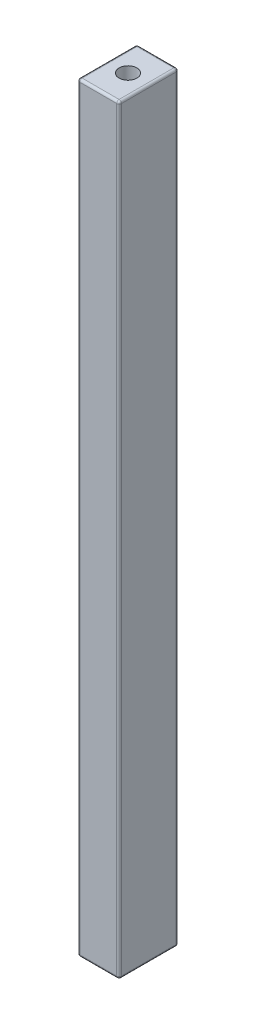
ISO-10303-21;
HEADER;
FILE_DESCRIPTION(('STEP AP214'),'2;1');
FILE_NAME('part.step','',(''),(''),'','','');
FILE_SCHEMA(('AUTOMOTIVE_DESIGN { 1 0 10303 214 1 1 1 1 }'));
ENDSEC;
DATA;
#1=APPLICATION_CONTEXT('core data for automotive mechanical design processes');
#2=APPLICATION_PROTOCOL_DEFINITION('international standard','automotive_design',2000,#1);
#3=PRODUCT_CONTEXT('',#1,'mechanical');
#4=PRODUCT('Part','Part','',(#3));
#5=PRODUCT_RELATED_PRODUCT_CATEGORY('part','',(#4));
#6=PRODUCT_DEFINITION_FORMATION('','',#4);
#7=PRODUCT_DEFINITION_CONTEXT('part definition',#1,'design');
#8=PRODUCT_DEFINITION('design','',#6,#7);
#9=PRODUCT_DEFINITION_SHAPE('','',#8);
#10=(LENGTH_UNIT() NAMED_UNIT(*) SI_UNIT(.MILLI.,.METRE.));
#11=(NAMED_UNIT(*) PLANE_ANGLE_UNIT() SI_UNIT($,.RADIAN.));
#12=(NAMED_UNIT(*) SI_UNIT($,.STERADIAN.) SOLID_ANGLE_UNIT());
#13=UNCERTAINTY_MEASURE_WITH_UNIT(LENGTH_MEASURE(1.E-05),#10,'distance_accuracy_value','');
#14=(GEOMETRIC_REPRESENTATION_CONTEXT(3) GLOBAL_UNCERTAINTY_ASSIGNED_CONTEXT((#13)) GLOBAL_UNIT_ASSIGNED_CONTEXT((#10,
#11,#12)) REPRESENTATION_CONTEXT('',''));
#15=CARTESIAN_POINT('',(0.,0.,0.));
#16=DIRECTION('',(0.,0.,1.));
#17=DIRECTION('',(1.,0.,0.));
#18=AXIS2_PLACEMENT_3D('',#15,#16,#17);
#19=CARTESIAN_POINT('',(-22.225,812.8,31.75));
#20=DIRECTION('',(1.,0.,0.));
#21=DIRECTION('',(0.,0.,1.));
#22=AXIS2_PLACEMENT_3D('',#19,#20,#21);
#23=PLANE('',#22);
#24=DIRECTION('',(0.,-1.,0.));
#25=VECTOR('',#24,1.);
#26=CARTESIAN_POINT('',(-22.225,738.8225,80.9625));
#27=LINE('',#26,#25);
#28=CARTESIAN_POINT('',(-22.225,738.8225,80.9625));
#29=VERTEX_POINT('',#28);
#30=CARTESIAN_POINT('',(-22.225,129.2225,80.9624999999999));
#31=VERTEX_POINT('',#30);
#32=EDGE_CURVE('E277',#29,#31,#27,.T.);
#33=ORIENTED_EDGE('',*,*,#32,.T.);
#34=CARTESIAN_POINT('',(-22.225,129.2225,73.0249999999999));
#35=DIRECTION('',(1.,0.,0.));
#36=DIRECTION('',(0.,0.,-1.));
#37=AXIS2_PLACEMENT_3D('',#34,#35,#36);
#38=CIRCLE('',#37,7.9375);
#39=CARTESIAN_POINT('',(-22.225,129.2225,65.0874999999999));
#40=VERTEX_POINT('',#39);
#41=EDGE_CURVE('E280',#31,#40,#38,.T.);
#42=ORIENTED_EDGE('',*,*,#41,.T.);
#43=DIRECTION('',(0.,1.,0.));
#44=VECTOR('',#43,1.);
#45=CARTESIAN_POINT('',(-22.225,738.8225,65.0875));
#46=LINE('',#45,#44);
#47=CARTESIAN_POINT('',(-22.225,738.8225,65.0875));
#48=VERTEX_POINT('',#47);
#49=EDGE_CURVE('E268',#40,#48,#46,.T.);
#50=ORIENTED_EDGE('',*,*,#49,.T.);
#51=CARTESIAN_POINT('',(-22.225,738.8225,73.025));
#52=DIRECTION('',(1.,0.,0.));
#53=DIRECTION('',(0.,0.,-1.));
#54=AXIS2_PLACEMENT_3D('',#51,#52,#53);
#55=CIRCLE('',#54,7.9375);
#56=EDGE_CURVE('E235',#48,#29,#55,.T.);
#57=ORIENTED_EDGE('',*,*,#56,.T.);
#58=EDGE_LOOP('',(#33,#42,#50,#57));
#59=FACE_BOUND('',#58,.T.);
#60=DIRECTION('',(0.,0.,-1.));
#61=VECTOR('',#60,1.);
#62=CARTESIAN_POINT('',(-22.225,810.26,95.25));
#63=LINE('',#62,#61);
#64=CARTESIAN_POINT('',(-22.225,810.26,34.29));
#65=VERTEX_POINT('',#64);
#66=CARTESIAN_POINT('',(-22.225,810.26,92.71));
#67=VERTEX_POINT('',#66);
#68=EDGE_CURVE('E350',#65,#67,#63,.F.);
#69=ORIENTED_EDGE('',*,*,#68,.F.);
#70=DIRECTION('',(0.,-1.,0.));
#71=VECTOR('',#70,1.);
#72=CARTESIAN_POINT('',(-22.225,812.8,34.29));
#73=LINE('',#72,#71);
#74=CARTESIAN_POINT('',(-22.225,2.53999999999999,34.29));
#75=VERTEX_POINT('',#74);
#76=EDGE_CURVE('E347',#75,#65,#73,.F.);
#77=ORIENTED_EDGE('',*,*,#76,.F.);
#78=DIRECTION('',(0.,0.,-1.));
#79=VECTOR('',#78,1.);
#80=CARTESIAN_POINT('',(-22.225,2.53999999999999,31.75));
#81=LINE('',#80,#79);
#82=CARTESIAN_POINT('',(-22.225,2.53999999999999,92.71));
#83=VERTEX_POINT('',#82);
#84=EDGE_CURVE('E353',#83,#75,#81,.T.);
#85=ORIENTED_EDGE('',*,*,#84,.F.);
#86=DIRECTION('',(0.,-1.,0.));
#87=VECTOR('',#86,1.);
#88=CARTESIAN_POINT('',(-22.225,812.8,92.71));
#89=LINE('',#88,#87);
#90=EDGE_CURVE('E356',#67,#83,#89,.T.);
#91=ORIENTED_EDGE('',*,*,#90,.F.);
#92=EDGE_LOOP('',(#69,#77,#85,#91));
#93=FACE_BOUND('',#92,.T.);
#94=ADVANCED_FACE('F35',(#59,#93),#23,.F.);
#95=CARTESIAN_POINT('',(22.225,812.8,31.75));
#96=DIRECTION('',(0.,0.,1.));
#97=DIRECTION('',(-1.,0.,0.));
#98=AXIS2_PLACEMENT_3D('',#95,#96,#97);
#99=PLANE('',#98);
#100=DIRECTION('',(0.,-1.,0.));
#101=VECTOR('',#100,1.);
#102=CARTESIAN_POINT('',(-6.35000000000003,342.9,31.75));
#103=LINE('',#102,#101);
#104=CARTESIAN_POINT('',(-6.35000000000003,342.9,31.75));
#105=VERTEX_POINT('',#104);
#106=CARTESIAN_POINT('',(-6.34999999999997,292.1,31.75));
#107=VERTEX_POINT('',#106);
#108=EDGE_CURVE('E214',#105,#107,#103,.T.);
#109=ORIENTED_EDGE('',*,*,#108,.T.);
#110=CARTESIAN_POINT('',(0.,292.1,31.75));
#111=DIRECTION('',(0.,0.,1.));
#112=DIRECTION('',(1.,0.,0.));
#113=AXIS2_PLACEMENT_3D('',#110,#111,#112);
#114=CIRCLE('',#113,6.35);
#115=CARTESIAN_POINT('',(6.34999999999997,292.1,31.75));
#116=VERTEX_POINT('',#115);
#117=EDGE_CURVE('E223',#107,#116,#114,.T.);
#118=ORIENTED_EDGE('',*,*,#117,.T.);
#119=DIRECTION('',(0.,1.,0.));
#120=VECTOR('',#119,1.);
#121=CARTESIAN_POINT('',(6.34999999999997,342.9,31.75));
#122=LINE('',#121,#120);
#123=CARTESIAN_POINT('',(6.34999999999997,342.9,31.75));
#124=VERTEX_POINT('',#123);
#125=EDGE_CURVE('E220',#116,#124,#122,.T.);
#126=ORIENTED_EDGE('',*,*,#125,.T.);
#127=CARTESIAN_POINT('',(0.,342.9,31.75));
#128=DIRECTION('',(0.,0.,1.));
#129=DIRECTION('',(1.,0.,0.));
#130=AXIS2_PLACEMENT_3D('',#127,#128,#129);
#131=CIRCLE('',#130,6.35);
#132=EDGE_CURVE('E228',#124,#105,#131,.T.);
#133=ORIENTED_EDGE('',*,*,#132,.T.);
#134=EDGE_LOOP('',(#109,#118,#126,#133));
#135=FACE_BOUND('',#134,.T.);
#136=DIRECTION('',(0.,-1.,0.));
#137=VECTOR('',#136,1.);
#138=CARTESIAN_POINT('',(-6.35000000000008,762.,31.75));
#139=LINE('',#138,#137);
#140=CARTESIAN_POINT('',(-6.35000000000008,762.,31.75));
#141=VERTEX_POINT('',#140);
#142=CARTESIAN_POINT('',(-6.35000000000006,711.2,31.75));
#143=VERTEX_POINT('',#142);
#144=EDGE_CURVE('E250',#141,#143,#139,.T.);
#145=ORIENTED_EDGE('',*,*,#144,.T.);
#146=CARTESIAN_POINT('',(0.,711.2,31.75));
#147=DIRECTION('',(0.,0.,1.));
#148=DIRECTION('',(1.,0.,0.));
#149=AXIS2_PLACEMENT_3D('',#146,#147,#148);
#150=CIRCLE('',#149,6.35);
#151=CARTESIAN_POINT('',(6.34999999999993,711.2,31.75));
#152=VERTEX_POINT('',#151);
#153=EDGE_CURVE('E253',#143,#152,#150,.T.);
#154=ORIENTED_EDGE('',*,*,#153,.T.);
#155=DIRECTION('',(0.,1.,0.));
#156=VECTOR('',#155,1.);
#157=CARTESIAN_POINT('',(6.34999999999992,762.,31.75));
#158=LINE('',#157,#156);
#159=CARTESIAN_POINT('',(6.34999999999992,762.,31.75));
#160=VERTEX_POINT('',#159);
#161=EDGE_CURVE('E242',#152,#160,#158,.T.);
#162=ORIENTED_EDGE('',*,*,#161,.T.);
#163=CARTESIAN_POINT('',(0.,762.,31.75));
#164=DIRECTION('',(0.,0.,1.));
#165=DIRECTION('',(1.,0.,0.));
#166=AXIS2_PLACEMENT_3D('',#163,#164,#165);
#167=CIRCLE('',#166,6.35);
#168=EDGE_CURVE('E248',#160,#141,#167,.T.);
#169=ORIENTED_EDGE('',*,*,#168,.T.);
#170=EDGE_LOOP('',(#145,#154,#162,#169));
#171=FACE_BOUND('',#170,.T.);
#172=DIRECTION('',(1.,0.,0.));
#173=VECTOR('',#172,1.);
#174=CARTESIAN_POINT('',(22.225,2.53999999999999,31.75));
#175=LINE('',#174,#173);
#176=CARTESIAN_POINT('',(-19.685,2.53999999999999,31.75));
#177=VERTEX_POINT('',#176);
#178=CARTESIAN_POINT('',(19.685,2.53999999999999,31.75));
#179=VERTEX_POINT('',#178);
#180=EDGE_CURVE('E305',#177,#179,#175,.T.);
#181=ORIENTED_EDGE('',*,*,#180,.F.);
#182=DIRECTION('',(0.,-1.,0.));
#183=VECTOR('',#182,1.);
#184=CARTESIAN_POINT('',(-19.685,812.8,31.75));
#185=LINE('',#184,#183);
#186=CARTESIAN_POINT('',(-19.685,810.26,31.75));
#187=VERTEX_POINT('',#186);
#188=EDGE_CURVE('E299',#187,#177,#185,.T.);
#189=ORIENTED_EDGE('',*,*,#188,.F.);
#190=DIRECTION('',(1.,0.,0.));
#191=VECTOR('',#190,1.);
#192=CARTESIAN_POINT('',(-22.225,810.26,31.75));
#193=LINE('',#192,#191);
#194=CARTESIAN_POINT('',(19.685,810.26,31.75));
#195=VERTEX_POINT('',#194);
#196=EDGE_CURVE('E302',#195,#187,#193,.F.);
#197=ORIENTED_EDGE('',*,*,#196,.F.);
#198=DIRECTION('',(0.,-1.,0.));
#199=VECTOR('',#198,1.);
#200=CARTESIAN_POINT('',(19.685,812.8,31.75));
#201=LINE('',#200,#199);
#202=EDGE_CURVE('E308',#179,#195,#201,.F.);
#203=ORIENTED_EDGE('',*,*,#202,.F.);
#204=EDGE_LOOP('',(#181,#189,#197,#203));
#205=FACE_BOUND('',#204,.T.);
#206=ADVANCED_FACE('F514',(#135,#171,#205),#99,.F.);
#207=CARTESIAN_POINT('',(22.225,812.8,31.75));
#208=DIRECTION('',(-1.,0.,0.));
#209=DIRECTION('',(0.,0.,-1.));
#210=AXIS2_PLACEMENT_3D('',#207,#208,#209);
#211=PLANE('',#210);
#212=DIRECTION('',(0.,0.,1.));
#213=VECTOR('',#212,1.);
#214=CARTESIAN_POINT('',(22.225,2.53999999999999,31.75));
#215=LINE('',#214,#213);
#216=CARTESIAN_POINT('',(22.225,2.53999999999999,34.29));
#217=VERTEX_POINT('',#216);
#218=CARTESIAN_POINT('',(22.225,2.53999999999999,92.71));
#219=VERTEX_POINT('',#218);
#220=EDGE_CURVE('E329',#217,#219,#215,.T.);
#221=ORIENTED_EDGE('',*,*,#220,.F.);
#222=DIRECTION('',(0.,-1.,0.));
#223=VECTOR('',#222,1.);
#224=CARTESIAN_POINT('',(22.225,812.8,34.29));
#225=LINE('',#224,#223);
#226=CARTESIAN_POINT('',(22.225,810.26,34.29));
#227=VERTEX_POINT('',#226);
#228=EDGE_CURVE('E323',#227,#217,#225,.T.);
#229=ORIENTED_EDGE('',*,*,#228,.F.);
#230=DIRECTION('',(0.,0.,1.));
#231=VECTOR('',#230,1.);
#232=CARTESIAN_POINT('',(22.225,810.26,31.75));
#233=LINE('',#232,#231);
#234=CARTESIAN_POINT('',(22.225,810.26,92.71));
#235=VERTEX_POINT('',#234);
#236=EDGE_CURVE('E326',#235,#227,#233,.F.);
#237=ORIENTED_EDGE('',*,*,#236,.F.);
#238=DIRECTION('',(0.,-1.,0.));
#239=VECTOR('',#238,1.);
#240=CARTESIAN_POINT('',(22.225,812.8,92.71));
#241=LINE('',#240,#239);
#242=EDGE_CURVE('E332',#219,#235,#241,.F.);
#243=ORIENTED_EDGE('',*,*,#242,.F.);
#244=EDGE_LOOP('',(#221,#229,#237,#243));
#245=FACE_BOUND('',#244,.T.);
#246=ADVANCED_FACE('F480',(#245),#211,.F.);
#247=CARTESIAN_POINT('',(22.225,812.8,95.25));
#248=DIRECTION('',(0.,0.,-1.));
#249=DIRECTION('',(1.,0.,0.));
#250=AXIS2_PLACEMENT_3D('',#247,#248,#249);
#251=PLANE('',#250);
#252=DIRECTION('',(-1.,0.,0.));
#253=VECTOR('',#252,1.);
#254=CARTESIAN_POINT('',(22.225,2.53999999999999,95.25));
#255=LINE('',#254,#253);
#256=CARTESIAN_POINT('',(19.685,2.53999999999999,95.25));
#257=VERTEX_POINT('',#256);
#258=CARTESIAN_POINT('',(-19.685,2.53999999999999,95.25));
#259=VERTEX_POINT('',#258);
#260=EDGE_CURVE('E341',#257,#259,#255,.T.);
#261=ORIENTED_EDGE('',*,*,#260,.F.);
#262=DIRECTION('',(0.,-1.,0.));
#263=VECTOR('',#262,1.);
#264=CARTESIAN_POINT('',(19.685,812.8,95.25));
#265=LINE('',#264,#263);
#266=CARTESIAN_POINT('',(19.685,810.26,95.25));
#267=VERTEX_POINT('',#266);
#268=EDGE_CURVE('E335',#267,#257,#265,.T.);
#269=ORIENTED_EDGE('',*,*,#268,.F.);
#270=DIRECTION('',(-1.,0.,0.));
#271=VECTOR('',#270,1.);
#272=CARTESIAN_POINT('',(22.225,810.26,95.25));
#273=LINE('',#272,#271);
#274=CARTESIAN_POINT('',(-19.685,810.26,95.25));
#275=VERTEX_POINT('',#274);
#276=EDGE_CURVE('E338',#275,#267,#273,.F.);
#277=ORIENTED_EDGE('',*,*,#276,.F.);
#278=DIRECTION('',(0.,-1.,0.));
#279=VECTOR('',#278,1.);
#280=CARTESIAN_POINT('',(-19.685,812.8,95.25));
#281=LINE('',#280,#279);
#282=EDGE_CURVE('E344',#259,#275,#281,.F.);
#283=ORIENTED_EDGE('',*,*,#282,.F.);
#284=EDGE_LOOP('',(#261,#269,#277,#283));
#285=FACE_BOUND('',#284,.T.);
#286=ADVANCED_FACE('F435',(#285),#251,.F.);
#287=CARTESIAN_POINT('',(0.,812.8,63.5));
#288=DIRECTION('',(0.,1.,0.));
#289=DIRECTION('',(0.,0.,-1.));
#290=AXIS2_PLACEMENT_3D('',#287,#288,#289);
#291=PLANE('',#290);
#292=CARTESIAN_POINT('',(0.,812.8,63.5));
#293=DIRECTION('',(0.,-1.,0.));
#294=DIRECTION('',(0.,0.,-1.));
#295=AXIS2_PLACEMENT_3D('',#292,#293,#294);
#296=CIRCLE('',#295,9.525);
#297=CARTESIAN_POINT('',(0.,812.8,53.975));
#298=VERTEX_POINT('',#297);
#299=EDGE_CURVE('E287',#298,#298,#296,.T.);
#300=ORIENTED_EDGE('',*,*,#299,.T.);
#301=EDGE_LOOP('',(#300));
#302=FACE_BOUND('',#301,.T.);
#303=DIRECTION('',(0.,0.,1.));
#304=VECTOR('',#303,1.);
#305=CARTESIAN_POINT('',(19.685,812.8,95.25));
#306=LINE('',#305,#304);
#307=CARTESIAN_POINT('',(19.685,812.8,34.29));
#308=VERTEX_POINT('',#307);
#309=CARTESIAN_POINT('',(19.685,812.8,92.71));
#310=VERTEX_POINT('',#309);
#311=EDGE_CURVE('E44',#308,#310,#306,.T.);
#312=ORIENTED_EDGE('',*,*,#311,.F.);
#313=DIRECTION('',(1.,0.,0.));
#314=VECTOR('',#313,1.);
#315=CARTESIAN_POINT('',(22.225,812.8,34.29));
#316=LINE('',#315,#314);
#317=CARTESIAN_POINT('',(-19.685,812.8,34.29));
#318=VERTEX_POINT('',#317);
#319=EDGE_CURVE('E362',#318,#308,#316,.T.);
#320=ORIENTED_EDGE('',*,*,#319,.F.);
#321=DIRECTION('',(0.,0.,-1.));
#322=VECTOR('',#321,1.);
#323=CARTESIAN_POINT('',(-19.685,812.8,31.75));
#324=LINE('',#323,#322);
#325=CARTESIAN_POINT('',(-19.685,812.8,92.71));
#326=VERTEX_POINT('',#325);
#327=EDGE_CURVE('E359',#326,#318,#324,.T.);
#328=ORIENTED_EDGE('',*,*,#327,.F.);
#329=DIRECTION('',(-1.,0.,0.));
#330=VECTOR('',#329,1.);
#331=CARTESIAN_POINT('',(-22.225,812.8,92.71));
#332=LINE('',#331,#330);
#333=EDGE_CURVE('E11',#310,#326,#332,.T.);
#334=ORIENTED_EDGE('',*,*,#333,.F.);
#335=EDGE_LOOP('',(#312,#320,#328,#334));
#336=FACE_BOUND('',#335,.T.);
#337=ADVANCED_FACE('F451',(#302,#336),#291,.T.);
#338=CARTESIAN_POINT('',(0.,0.,63.5));
#339=DIRECTION('',(0.,1.,0.));
#340=DIRECTION('',(0.,0.,-1.));
#341=AXIS2_PLACEMENT_3D('',#338,#339,#340);
#342=PLANE('',#341);
#343=DIRECTION('',(0.,0.,1.));
#344=VECTOR('',#343,1.);
#345=CARTESIAN_POINT('',(19.685,0.,63.5));
#346=LINE('',#345,#344);
#347=CARTESIAN_POINT('',(19.685,0.,92.71));
#348=VERTEX_POINT('',#347);
#349=CARTESIAN_POINT('',(19.685,0.,34.29));
#350=VERTEX_POINT('',#349);
#351=EDGE_CURVE('E317',#348,#350,#346,.F.);
#352=ORIENTED_EDGE('',*,*,#351,.F.);
#353=DIRECTION('',(-1.,0.,0.));
#354=VECTOR('',#353,1.);
#355=CARTESIAN_POINT('',(0.,0.,92.71));
#356=LINE('',#355,#354);
#357=CARTESIAN_POINT('',(-19.685,0.,92.71));
#358=VERTEX_POINT('',#357);
#359=EDGE_CURVE('E314',#358,#348,#356,.F.);
#360=ORIENTED_EDGE('',*,*,#359,.F.);
#361=DIRECTION('',(0.,0.,-1.));
#362=VECTOR('',#361,1.);
#363=CARTESIAN_POINT('',(-19.685,0.,63.5));
#364=LINE('',#363,#362);
#365=CARTESIAN_POINT('',(-19.685,0.,34.29));
#366=VERTEX_POINT('',#365);
#367=EDGE_CURVE('E311',#366,#358,#364,.F.);
#368=ORIENTED_EDGE('',*,*,#367,.F.);
#369=DIRECTION('',(1.,0.,0.));
#370=VECTOR('',#369,1.);
#371=CARTESIAN_POINT('',(0.,0.,34.29));
#372=LINE('',#371,#370);
#373=EDGE_CURVE('E320',#350,#366,#372,.F.);
#374=ORIENTED_EDGE('',*,*,#373,.F.);
#375=EDGE_LOOP('',(#352,#360,#368,#374));
#376=FACE_BOUND('',#375,.T.);
#377=ADVANCED_FACE('F503',(#376),#342,.F.);
#378=CARTESIAN_POINT('',(0.,810.26,92.71));
#379=DIRECTION('',(1.,0.,0.));
#380=DIRECTION('',(0.,0.,1.));
#381=AXIS2_PLACEMENT_3D('',#378,#379,#380);
#382=CYLINDRICAL_SURFACE('',#381,2.54);
#383=CARTESIAN_POINT('',(-19.685,810.26,92.71));
#384=DIRECTION('',(1.,0.,0.));
#385=DIRECTION('',(0.,0.,-1.));
#386=AXIS2_PLACEMENT_3D('',#383,#384,#385);
#387=CIRCLE('',#386,2.54);
#388=EDGE_CURVE('E39',#326,#275,#387,.T.);
#389=ORIENTED_EDGE('',*,*,#388,.T.);
#390=ORIENTED_EDGE('',*,*,#276,.T.);
#391=CARTESIAN_POINT('',(19.685,810.26,92.71));
#392=DIRECTION('',(-1.,0.,0.));
#393=DIRECTION('',(0.,0.,1.));
#394=AXIS2_PLACEMENT_3D('',#391,#392,#393);
#395=CIRCLE('',#394,2.54);
#396=EDGE_CURVE('E418',#267,#310,#395,.T.);
#397=ORIENTED_EDGE('',*,*,#396,.T.);
#398=ORIENTED_EDGE('',*,*,#333,.T.);
#399=EDGE_LOOP('',(#389,#390,#397,#398));
#400=FACE_BOUND('',#399,.T.);
#401=ADVANCED_FACE('F37',(#400),#382,.T.);
#402=CARTESIAN_POINT('',(-19.685,810.26,92.71));
#403=DIRECTION('',(0.,0.,-1.));
#404=DIRECTION('',(1.,0.,0.));
#405=AXIS2_PLACEMENT_3D('',#402,#403,#404);
#406=SPHERICAL_SURFACE('',#405,2.54);
#407=CARTESIAN_POINT('',(-19.685,810.26,92.71));
#408=DIRECTION('',(0.,0.,-1.));
#409=DIRECTION('',(-1.,0.,0.));
#410=AXIS2_PLACEMENT_3D('',#407,#408,#409);
#411=CIRCLE('',#410,2.54);
#412=EDGE_CURVE('E414',#326,#67,#411,.F.);
#413=ORIENTED_EDGE('',*,*,#412,.T.);
#414=CARTESIAN_POINT('',(-19.685,810.26,92.71));
#415=DIRECTION('',(0.,-1.,0.));
#416=DIRECTION('',(0.,0.,-1.));
#417=AXIS2_PLACEMENT_3D('',#414,#415,#416);
#418=CIRCLE('',#417,2.54);
#419=EDGE_CURVE('E417',#67,#275,#418,.F.);
#420=ORIENTED_EDGE('',*,*,#419,.T.);
#421=ORIENTED_EDGE('',*,*,#388,.F.);
#422=EDGE_LOOP('',(#413,#420,#421));
#423=FACE_BOUND('',#422,.T.);
#424=ADVANCED_FACE('F457',(#423),#406,.T.);
#425=CARTESIAN_POINT('',(19.685,810.26,92.71));
#426=DIRECTION('',(0.,0.,-1.));
#427=DIRECTION('',(1.,0.,0.));
#428=AXIS2_PLACEMENT_3D('',#425,#426,#427);
#429=SPHERICAL_SURFACE('',#428,2.54);
#430=CARTESIAN_POINT('',(19.685,810.26,92.71));
#431=DIRECTION('',(0.,-1.,0.));
#432=DIRECTION('',(0.,0.,-1.));
#433=AXIS2_PLACEMENT_3D('',#430,#431,#432);
#434=CIRCLE('',#433,2.54);
#435=EDGE_CURVE('E409',#267,#235,#434,.F.);
#436=ORIENTED_EDGE('',*,*,#435,.T.);
#437=CARTESIAN_POINT('',(19.685,810.26,92.71));
#438=DIRECTION('',(0.,0.,-1.));
#439=DIRECTION('',(-1.,0.,0.));
#440=AXIS2_PLACEMENT_3D('',#437,#438,#439);
#441=CIRCLE('',#440,2.54);
#442=EDGE_CURVE('E412',#235,#310,#441,.F.);
#443=ORIENTED_EDGE('',*,*,#442,.T.);
#444=ORIENTED_EDGE('',*,*,#396,.F.);
#445=EDGE_LOOP('',(#436,#443,#444));
#446=FACE_BOUND('',#445,.T.);
#447=ADVANCED_FACE('F442',(#446),#429,.T.);
#448=CARTESIAN_POINT('',(-19.685,812.8,92.71));
#449=DIRECTION('',(0.,-1.,0.));
#450=DIRECTION('',(0.,0.,1.));
#451=AXIS2_PLACEMENT_3D('',#448,#449,#450);
#452=CYLINDRICAL_SURFACE('',#451,2.54);
#453=ORIENTED_EDGE('',*,*,#419,.F.);
#454=ORIENTED_EDGE('',*,*,#90,.T.);
#455=CARTESIAN_POINT('',(-19.685,2.53999999999999,92.71));
#456=DIRECTION('',(0.,1.,0.));
#457=DIRECTION('',(0.,0.,1.));
#458=AXIS2_PLACEMENT_3D('',#455,#456,#457);
#459=CIRCLE('',#458,2.54);
#460=EDGE_CURVE('E403',#83,#259,#459,.T.);
#461=ORIENTED_EDGE('',*,*,#460,.T.);
#462=ORIENTED_EDGE('',*,*,#282,.T.);
#463=EDGE_LOOP('',(#453,#454,#461,#462));
#464=FACE_BOUND('',#463,.T.);
#465=ADVANCED_FACE('F431',(#464),#452,.T.);
#466=CARTESIAN_POINT('',(-19.685,810.26,63.5));
#467=DIRECTION('',(0.,0.,1.));
#468=DIRECTION('',(-1.,0.,0.));
#469=AXIS2_PLACEMENT_3D('',#466,#467,#468);
#470=CYLINDRICAL_SURFACE('',#469,2.54);
#471=ORIENTED_EDGE('',*,*,#412,.F.);
#472=ORIENTED_EDGE('',*,*,#327,.T.);
#473=CARTESIAN_POINT('',(-19.685,810.26,34.29));
#474=DIRECTION('',(0.,0.,1.));
#475=DIRECTION('',(1.,0.,0.));
#476=AXIS2_PLACEMENT_3D('',#473,#474,#475);
#477=CIRCLE('',#476,2.54);
#478=EDGE_CURVE('E400',#318,#65,#477,.T.);
#479=ORIENTED_EDGE('',*,*,#478,.T.);
#480=ORIENTED_EDGE('',*,*,#68,.T.);
#481=EDGE_LOOP('',(#471,#472,#479,#480));
#482=FACE_BOUND('',#481,.T.);
#483=ADVANCED_FACE('F453',(#482),#470,.T.);
#484=CARTESIAN_POINT('',(0.,810.26,34.29));
#485=DIRECTION('',(-1.,0.,0.));
#486=DIRECTION('',(0.,0.,-1.));
#487=AXIS2_PLACEMENT_3D('',#484,#485,#486);
#488=CYLINDRICAL_SURFACE('',#487,2.54);
#489=CARTESIAN_POINT('',(19.685,810.26,34.29));
#490=DIRECTION('',(-1.,0.,0.));
#491=DIRECTION('',(0.,0.,1.));
#492=AXIS2_PLACEMENT_3D('',#489,#490,#491);
#493=CIRCLE('',#492,2.54);
#494=EDGE_CURVE('E395',#308,#195,#493,.T.);
#495=ORIENTED_EDGE('',*,*,#494,.T.);
#496=ORIENTED_EDGE('',*,*,#196,.T.);
#497=CARTESIAN_POINT('',(-19.685,810.26,34.29));
#498=DIRECTION('',(1.,0.,0.));
#499=DIRECTION('',(0.,0.,-1.));
#500=AXIS2_PLACEMENT_3D('',#497,#498,#499);
#501=CIRCLE('',#500,2.54);
#502=EDGE_CURVE('E398',#187,#318,#501,.T.);
#503=ORIENTED_EDGE('',*,*,#502,.T.);
#504=ORIENTED_EDGE('',*,*,#319,.T.);
#505=EDGE_LOOP('',(#495,#496,#503,#504));
#506=FACE_BOUND('',#505,.T.);
#507=ADVANCED_FACE('F488',(#506),#488,.T.);
#508=CARTESIAN_POINT('',(19.685,810.26,63.5));
#509=DIRECTION('',(0.,0.,-1.));
#510=DIRECTION('',(1.,0.,0.));
#511=AXIS2_PLACEMENT_3D('',#508,#509,#510);
#512=CYLINDRICAL_SURFACE('',#511,2.54);
#513=ORIENTED_EDGE('',*,*,#442,.F.);
#514=ORIENTED_EDGE('',*,*,#236,.T.);
#515=CARTESIAN_POINT('',(19.685,810.26,34.29));
#516=DIRECTION('',(0.,0.,1.));
#517=DIRECTION('',(1.,0.,0.));
#518=AXIS2_PLACEMENT_3D('',#515,#516,#517);
#519=CIRCLE('',#518,2.54);
#520=EDGE_CURVE('E393',#227,#308,#519,.T.);
#521=ORIENTED_EDGE('',*,*,#520,.T.);
#522=ORIENTED_EDGE('',*,*,#311,.T.);
#523=EDGE_LOOP('',(#513,#514,#521,#522));
#524=FACE_BOUND('',#523,.T.);
#525=ADVANCED_FACE('F444',(#524),#512,.T.);
#526=CARTESIAN_POINT('',(19.685,812.8,92.71));
#527=DIRECTION('',(0.,-1.,0.));
#528=DIRECTION('',(0.,0.,1.));
#529=AXIS2_PLACEMENT_3D('',#526,#527,#528);
#530=CYLINDRICAL_SURFACE('',#529,2.54);
#531=ORIENTED_EDGE('',*,*,#435,.F.);
#532=ORIENTED_EDGE('',*,*,#268,.T.);
#533=CARTESIAN_POINT('',(19.685,2.53999999999999,92.71));
#534=DIRECTION('',(0.,1.,0.));
#535=DIRECTION('',(0.,0.,1.));
#536=AXIS2_PLACEMENT_3D('',#533,#534,#535);
#537=CIRCLE('',#536,2.54);
#538=EDGE_CURVE('E390',#257,#219,#537,.T.);
#539=ORIENTED_EDGE('',*,*,#538,.T.);
#540=ORIENTED_EDGE('',*,*,#242,.T.);
#541=EDGE_LOOP('',(#531,#532,#539,#540));
#542=FACE_BOUND('',#541,.T.);
#543=ADVANCED_FACE('F437',(#542),#530,.T.);
#544=CARTESIAN_POINT('',(22.225,2.53999999999999,92.71));
#545=DIRECTION('',(-1.,0.,0.));
#546=DIRECTION('',(0.,0.,-1.));
#547=AXIS2_PLACEMENT_3D('',#544,#545,#546);
#548=CYLINDRICAL_SURFACE('',#547,2.54);
#549=CARTESIAN_POINT('',(-19.685,2.53999999999999,92.71));
#550=DIRECTION('',(1.,0.,0.));
#551=DIRECTION('',(0.,0.,-1.));
#552=AXIS2_PLACEMENT_3D('',#549,#550,#551);
#553=CIRCLE('',#552,2.54);
#554=EDGE_CURVE('E406',#259,#358,#553,.T.);
#555=ORIENTED_EDGE('',*,*,#554,.T.);
#556=ORIENTED_EDGE('',*,*,#359,.T.);
#557=CARTESIAN_POINT('',(19.685,2.54,92.71));
#558=DIRECTION('',(-1.,0.,0.));
#559=DIRECTION('',(0.,0.,1.));
#560=AXIS2_PLACEMENT_3D('',#557,#558,#559);
#561=CIRCLE('',#560,2.54);
#562=EDGE_CURVE('E388',#348,#257,#561,.T.);
#563=ORIENTED_EDGE('',*,*,#562,.T.);
#564=ORIENTED_EDGE('',*,*,#260,.T.);
#565=EDGE_LOOP('',(#555,#556,#563,#564));
#566=FACE_BOUND('',#565,.T.);
#567=ADVANCED_FACE('F469',(#566),#548,.T.);
#568=CARTESIAN_POINT('',(-19.685,2.54,92.71));
#569=DIRECTION('',(0.,0.,-1.));
#570=DIRECTION('',(1.,0.,0.));
#571=AXIS2_PLACEMENT_3D('',#568,#569,#570);
#572=SPHERICAL_SURFACE('',#571,2.54);
#573=ORIENTED_EDGE('',*,*,#460,.F.);
#574=CARTESIAN_POINT('',(-19.685,2.54,92.71));
#575=DIRECTION('',(0.,0.,-1.));
#576=DIRECTION('',(-1.,0.,0.));
#577=AXIS2_PLACEMENT_3D('',#574,#575,#576);
#578=CIRCLE('',#577,2.54);
#579=EDGE_CURVE('E386',#83,#358,#578,.F.);
#580=ORIENTED_EDGE('',*,*,#579,.T.);
#581=ORIENTED_EDGE('',*,*,#554,.F.);
#582=EDGE_LOOP('',(#573,#580,#581));
#583=FACE_BOUND('',#582,.T.);
#584=ADVANCED_FACE('F467',(#583),#572,.T.);
#585=CARTESIAN_POINT('',(-19.685,810.26,34.29));
#586=DIRECTION('',(0.,0.,-1.));
#587=DIRECTION('',(1.,0.,0.));
#588=AXIS2_PLACEMENT_3D('',#585,#586,#587);
#589=SPHERICAL_SURFACE('',#588,2.54);
#590=ORIENTED_EDGE('',*,*,#502,.F.);
#591=CARTESIAN_POINT('',(-19.685,810.26,34.29));
#592=DIRECTION('',(0.,-1.,0.));
#593=DIRECTION('',(0.,0.,-1.));
#594=AXIS2_PLACEMENT_3D('',#591,#592,#593);
#595=CIRCLE('',#594,2.54);
#596=EDGE_CURVE('E384',#187,#65,#595,.F.);
#597=ORIENTED_EDGE('',*,*,#596,.T.);
#598=ORIENTED_EDGE('',*,*,#478,.F.);
#599=EDGE_LOOP('',(#590,#597,#598));
#600=FACE_BOUND('',#599,.T.);
#601=ADVANCED_FACE('F492',(#600),#589,.T.);
#602=CARTESIAN_POINT('',(19.685,810.26,34.29));
#603=DIRECTION('',(0.,0.,-1.));
#604=DIRECTION('',(1.,0.,0.));
#605=AXIS2_PLACEMENT_3D('',#602,#603,#604);
#606=SPHERICAL_SURFACE('',#605,2.54);
#607=ORIENTED_EDGE('',*,*,#520,.F.);
#608=CARTESIAN_POINT('',(19.685,810.26,34.29));
#609=DIRECTION('',(0.,-1.,0.));
#610=DIRECTION('',(0.,0.,-1.));
#611=AXIS2_PLACEMENT_3D('',#608,#609,#610);
#612=CIRCLE('',#611,2.54);
#613=EDGE_CURVE('E382',#227,#195,#612,.F.);
#614=ORIENTED_EDGE('',*,*,#613,.T.);
#615=ORIENTED_EDGE('',*,*,#494,.F.);
#616=EDGE_LOOP('',(#607,#614,#615));
#617=FACE_BOUND('',#616,.T.);
#618=ADVANCED_FACE('F486',(#617),#606,.T.);
#619=CARTESIAN_POINT('',(19.685,2.54,92.71));
#620=DIRECTION('',(0.,0.,-1.));
#621=DIRECTION('',(1.,0.,0.));
#622=AXIS2_PLACEMENT_3D('',#619,#620,#621);
#623=SPHERICAL_SURFACE('',#622,2.54);
#624=ORIENTED_EDGE('',*,*,#562,.F.);
#625=CARTESIAN_POINT('',(19.685,2.53999999999999,92.71));
#626=DIRECTION('',(0.,0.,-1.));
#627=DIRECTION('',(-1.,0.,0.));
#628=AXIS2_PLACEMENT_3D('',#625,#626,#627);
#629=CIRCLE('',#628,2.54);
#630=EDGE_CURVE('E380',#348,#219,#629,.F.);
#631=ORIENTED_EDGE('',*,*,#630,.T.);
#632=ORIENTED_EDGE('',*,*,#538,.F.);
#633=EDGE_LOOP('',(#624,#631,#632));
#634=FACE_BOUND('',#633,.T.);
#635=ADVANCED_FACE('F473',(#634),#623,.T.);
#636=CARTESIAN_POINT('',(-19.685,2.53999999999999,31.75));
#637=DIRECTION('',(0.,0.,-1.));
#638=DIRECTION('',(1.,0.,0.));
#639=AXIS2_PLACEMENT_3D('',#636,#637,#638);
#640=CYLINDRICAL_SURFACE('',#639,2.54);
#641=ORIENTED_EDGE('',*,*,#579,.F.);
#642=ORIENTED_EDGE('',*,*,#84,.T.);
#643=CARTESIAN_POINT('',(-19.685,2.53999999999999,34.29));
#644=DIRECTION('',(0.,0.,1.));
#645=DIRECTION('',(1.,0.,0.));
#646=AXIS2_PLACEMENT_3D('',#643,#644,#645);
#647=CIRCLE('',#646,2.54);
#648=EDGE_CURVE('E377',#75,#366,#647,.T.);
#649=ORIENTED_EDGE('',*,*,#648,.T.);
#650=ORIENTED_EDGE('',*,*,#367,.T.);
#651=EDGE_LOOP('',(#641,#642,#649,#650));
#652=FACE_BOUND('',#651,.T.);
#653=ADVANCED_FACE('F462',(#652),#640,.T.);
#654=CARTESIAN_POINT('',(-19.685,812.8,34.29));
#655=DIRECTION('',(0.,-1.,0.));
#656=DIRECTION('',(0.,0.,1.));
#657=AXIS2_PLACEMENT_3D('',#654,#655,#656);
#658=CYLINDRICAL_SURFACE('',#657,2.54);
#659=ORIENTED_EDGE('',*,*,#596,.F.);
#660=ORIENTED_EDGE('',*,*,#188,.T.);
#661=CARTESIAN_POINT('',(-19.685,2.53999999999999,34.29));
#662=DIRECTION('',(0.,1.,0.));
#663=DIRECTION('',(0.,0.,1.));
#664=AXIS2_PLACEMENT_3D('',#661,#662,#663);
#665=CIRCLE('',#664,2.54);
#666=EDGE_CURVE('E375',#177,#75,#665,.T.);
#667=ORIENTED_EDGE('',*,*,#666,.T.);
#668=ORIENTED_EDGE('',*,*,#76,.T.);
#669=EDGE_LOOP('',(#659,#660,#667,#668));
#670=FACE_BOUND('',#669,.T.);
#671=ADVANCED_FACE('F494',(#670),#658,.T.);
#672=CARTESIAN_POINT('',(19.685,812.8,34.29));
#673=DIRECTION('',(0.,-1.,0.));
#674=DIRECTION('',(0.,0.,1.));
#675=AXIS2_PLACEMENT_3D('',#672,#673,#674);
#676=CYLINDRICAL_SURFACE('',#675,2.54);
#677=ORIENTED_EDGE('',*,*,#613,.F.);
#678=ORIENTED_EDGE('',*,*,#228,.T.);
#679=CARTESIAN_POINT('',(19.685,2.53999999999999,34.29));
#680=DIRECTION('',(0.,1.,0.));
#681=DIRECTION('',(0.,0.,1.));
#682=AXIS2_PLACEMENT_3D('',#679,#680,#681);
#683=CIRCLE('',#682,2.54);
#684=EDGE_CURVE('E372',#217,#179,#683,.T.);
#685=ORIENTED_EDGE('',*,*,#684,.T.);
#686=ORIENTED_EDGE('',*,*,#202,.T.);
#687=EDGE_LOOP('',(#677,#678,#685,#686));
#688=FACE_BOUND('',#687,.T.);
#689=ADVANCED_FACE('F482',(#688),#676,.T.);
#690=CARTESIAN_POINT('',(19.685,2.53999999999999,31.75));
#691=DIRECTION('',(0.,0.,1.));
#692=DIRECTION('',(-1.,0.,0.));
#693=AXIS2_PLACEMENT_3D('',#690,#691,#692);
#694=CYLINDRICAL_SURFACE('',#693,2.54);
#695=ORIENTED_EDGE('',*,*,#630,.F.);
#696=ORIENTED_EDGE('',*,*,#351,.T.);
#697=CARTESIAN_POINT('',(19.685,2.54,34.29));
#698=DIRECTION('',(0.,0.,1.));
#699=DIRECTION('',(1.,0.,0.));
#700=AXIS2_PLACEMENT_3D('',#697,#698,#699);
#701=CIRCLE('',#700,2.54);
#702=EDGE_CURVE('E370',#350,#217,#701,.T.);
#703=ORIENTED_EDGE('',*,*,#702,.T.);
#704=ORIENTED_EDGE('',*,*,#220,.T.);
#705=EDGE_LOOP('',(#695,#696,#703,#704));
#706=FACE_BOUND('',#705,.T.);
#707=ADVANCED_FACE('F475',(#706),#694,.T.);
#708=CARTESIAN_POINT('',(-19.685,2.54,34.29));
#709=DIRECTION('',(0.,0.,-1.));
#710=DIRECTION('',(1.,0.,0.));
#711=AXIS2_PLACEMENT_3D('',#708,#709,#710);
#712=SPHERICAL_SURFACE('',#711,2.54);
#713=ORIENTED_EDGE('',*,*,#666,.F.);
#714=CARTESIAN_POINT('',(-19.685,2.54,34.29));
#715=DIRECTION('',(1.,0.,0.));
#716=DIRECTION('',(0.,0.,-1.));
#717=AXIS2_PLACEMENT_3D('',#714,#715,#716);
#718=CIRCLE('',#717,2.54);
#719=EDGE_CURVE('E368',#177,#366,#718,.F.);
#720=ORIENTED_EDGE('',*,*,#719,.T.);
#721=ORIENTED_EDGE('',*,*,#648,.F.);
#722=EDGE_LOOP('',(#713,#720,#721));
#723=FACE_BOUND('',#722,.T.);
#724=ADVANCED_FACE('F498',(#723),#712,.T.);
#725=CARTESIAN_POINT('',(19.685,2.54,34.29));
#726=DIRECTION('',(0.,0.,-1.));
#727=DIRECTION('',(1.,0.,0.));
#728=AXIS2_PLACEMENT_3D('',#725,#726,#727);
#729=SPHERICAL_SURFACE('',#728,2.54);
#730=ORIENTED_EDGE('',*,*,#702,.F.);
#731=CARTESIAN_POINT('',(19.685,2.53999999999999,34.29));
#732=DIRECTION('',(-1.,0.,0.));
#733=DIRECTION('',(0.,0.,1.));
#734=AXIS2_PLACEMENT_3D('',#731,#732,#733);
#735=CIRCLE('',#734,2.54);
#736=EDGE_CURVE('E296',#350,#179,#735,.F.);
#737=ORIENTED_EDGE('',*,*,#736,.T.);
#738=ORIENTED_EDGE('',*,*,#684,.F.);
#739=EDGE_LOOP('',(#730,#737,#738));
#740=FACE_BOUND('',#739,.T.);
#741=ADVANCED_FACE('F527',(#740),#729,.T.);
#742=CARTESIAN_POINT('',(22.225,2.53999999999999,34.29));
#743=DIRECTION('',(1.,0.,0.));
#744=DIRECTION('',(0.,0.,1.));
#745=AXIS2_PLACEMENT_3D('',#742,#743,#744);
#746=CYLINDRICAL_SURFACE('',#745,2.54);
#747=ORIENTED_EDGE('',*,*,#719,.F.);
#748=ORIENTED_EDGE('',*,*,#180,.T.);
#749=ORIENTED_EDGE('',*,*,#736,.F.);
#750=ORIENTED_EDGE('',*,*,#373,.T.);
#751=EDGE_LOOP('',(#747,#748,#749,#750));
#752=FACE_BOUND('',#751,.T.);
#753=ADVANCED_FACE('F500',(#752),#746,.T.);
#754=CARTESIAN_POINT('',(0.,787.4,63.5));
#755=DIRECTION('',(0.,1.,0.));
#756=DIRECTION('',(0.,0.,-1.));
#757=AXIS2_PLACEMENT_3D('',#754,#755,#756);
#758=CYLINDRICAL_SURFACE('',#757,9.525);
#759=CARTESIAN_POINT('',(0.,787.4,63.5));
#760=DIRECTION('',(0.,-1.,0.));
#761=DIRECTION('',(0.,0.,-1.));
#762=AXIS2_PLACEMENT_3D('',#759,#760,#761);
#763=CIRCLE('',#762,9.525);
#764=CARTESIAN_POINT('',(0.,787.4,53.975));
#765=VERTEX_POINT('',#764);
#766=EDGE_CURVE('E293',#765,#765,#763,.T.);
#767=ORIENTED_EDGE('',*,*,#766,.T.);
#768=EDGE_LOOP('',(#767));
#769=FACE_BOUND('',#768,.T.);
#770=ORIENTED_EDGE('',*,*,#299,.F.);
#771=EDGE_LOOP('',(#770));
#772=FACE_BOUND('',#771,.T.);
#773=ADVANCED_FACE('F526',(#769,#772),#758,.F.);
#774=CARTESIAN_POINT('',(0.,787.4,63.5));
#775=DIRECTION('',(0.,1.,0.));
#776=DIRECTION('',(0.,0.,-1.));
#777=AXIS2_PLACEMENT_3D('',#774,#775,#776);
#778=PLANE('',#777);
#779=ORIENTED_EDGE('',*,*,#766,.F.);
#780=EDGE_LOOP('',(#779));
#781=FACE_BOUND('',#780,.T.);
#782=ADVANCED_FACE('F664',(#781),#778,.T.);
#783=CARTESIAN_POINT('',(1.27000000000001,738.8225,73.025));
#784=DIRECTION('',(-1.,0.,0.));
#785=DIRECTION('',(0.,0.,-1.));
#786=AXIS2_PLACEMENT_3D('',#783,#784,#785);
#787=CYLINDRICAL_SURFACE('',#786,7.9375);
#788=ORIENTED_EDGE('',*,*,#56,.F.);
#789=DIRECTION('',(-1.,0.,0.));
#790=VECTOR('',#789,1.);
#791=CARTESIAN_POINT('',(1.27000000000001,738.8225,65.0875));
#792=LINE('',#791,#790);
#793=CARTESIAN_POINT('',(1.27000000000001,738.8225,65.0875));
#794=VERTEX_POINT('',#793);
#795=EDGE_CURVE('E285',#794,#48,#792,.T.);
#796=ORIENTED_EDGE('',*,*,#795,.F.);
#797=CARTESIAN_POINT('',(1.27000000000001,738.8225,73.025));
#798=DIRECTION('',(1.,0.,0.));
#799=DIRECTION('',(0.,0.,-1.));
#800=AXIS2_PLACEMENT_3D('',#797,#798,#799);
#801=CIRCLE('',#800,7.9375);
#802=CARTESIAN_POINT('',(1.27000000000001,738.8225,80.9625));
#803=VERTEX_POINT('',#802);
#804=EDGE_CURVE('E264',#794,#803,#801,.T.);
#805=ORIENTED_EDGE('',*,*,#804,.T.);
#806=DIRECTION('',(-1.,0.,0.));
#807=VECTOR('',#806,1.);
#808=CARTESIAN_POINT('',(1.27000000000001,738.8225,80.9625));
#809=LINE('',#808,#807);
#810=EDGE_CURVE('E274',#803,#29,#809,.T.);
#811=ORIENTED_EDGE('',*,*,#810,.T.);
#812=EDGE_LOOP('',(#788,#796,#805,#811));
#813=FACE_BOUND('',#812,.T.);
#814=ADVANCED_FACE('F673',(#813),#787,.F.);
#815=CARTESIAN_POINT('',(1.27000000000001,738.8225,65.0875));
#816=DIRECTION('',(0.,0.,-1.));
#817=DIRECTION('',(0.,-1.,0.));
#818=AXIS2_PLACEMENT_3D('',#815,#816,#817);
#819=PLANE('',#818);
#820=ORIENTED_EDGE('',*,*,#49,.F.);
#821=DIRECTION('',(-1.,0.,0.));
#822=VECTOR('',#821,1.);
#823=CARTESIAN_POINT('',(1.27000000000001,129.2225,65.0874999999999));
#824=LINE('',#823,#822);
#825=CARTESIAN_POINT('',(1.27000000000001,129.2225,65.0874999999999));
#826=VERTEX_POINT('',#825);
#827=EDGE_CURVE('E288',#826,#40,#824,.T.);
#828=ORIENTED_EDGE('',*,*,#827,.F.);
#829=DIRECTION('',(0.,1.,0.));
#830=VECTOR('',#829,1.);
#831=CARTESIAN_POINT('',(1.27000000000001,738.8225,65.0875));
#832=LINE('',#831,#830);
#833=EDGE_CURVE('E272',#826,#794,#832,.T.);
#834=ORIENTED_EDGE('',*,*,#833,.T.);
#835=ORIENTED_EDGE('',*,*,#795,.T.);
#836=EDGE_LOOP('',(#820,#828,#834,#835));
#837=FACE_BOUND('',#836,.T.);
#838=ADVANCED_FACE('F683',(#837),#819,.F.);
#839=CARTESIAN_POINT('',(1.27000000000001,129.2225,73.0249999999999));
#840=DIRECTION('',(-1.,0.,0.));
#841=DIRECTION('',(0.,0.,-1.));
#842=AXIS2_PLACEMENT_3D('',#839,#840,#841);
#843=CYLINDRICAL_SURFACE('',#842,7.9375);
#844=ORIENTED_EDGE('',*,*,#41,.F.);
#845=DIRECTION('',(-1.,0.,0.));
#846=VECTOR('',#845,1.);
#847=CARTESIAN_POINT('',(1.27000000000001,129.2225,80.9624999999999));
#848=LINE('',#847,#846);
#849=CARTESIAN_POINT('',(1.27000000000001,129.2225,80.9624999999999));
#850=VERTEX_POINT('',#849);
#851=EDGE_CURVE('E290',#850,#31,#848,.T.);
#852=ORIENTED_EDGE('',*,*,#851,.F.);
#853=CARTESIAN_POINT('',(1.27000000000001,129.2225,73.0249999999999));
#854=DIRECTION('',(1.,0.,0.));
#855=DIRECTION('',(0.,0.,-1.));
#856=AXIS2_PLACEMENT_3D('',#853,#854,#855);
#857=CIRCLE('',#856,7.9375);
#858=EDGE_CURVE('E270',#850,#826,#857,.T.);
#859=ORIENTED_EDGE('',*,*,#858,.T.);
#860=ORIENTED_EDGE('',*,*,#827,.T.);
#861=EDGE_LOOP('',(#844,#852,#859,#860));
#862=FACE_BOUND('',#861,.T.);
#863=ADVANCED_FACE('F693',(#862),#843,.F.);
#864=CARTESIAN_POINT('',(1.27000000000001,738.8225,80.9625));
#865=DIRECTION('',(0.,0.,1.));
#866=DIRECTION('',(0.,1.,0.));
#867=AXIS2_PLACEMENT_3D('',#864,#865,#866);
#868=PLANE('',#867);
#869=ORIENTED_EDGE('',*,*,#32,.F.);
#870=ORIENTED_EDGE('',*,*,#810,.F.);
#871=DIRECTION('',(0.,-1.,0.));
#872=VECTOR('',#871,1.);
#873=CARTESIAN_POINT('',(1.27000000000001,738.8225,80.9625));
#874=LINE('',#873,#872);
#875=EDGE_CURVE('E267',#803,#850,#874,.T.);
#876=ORIENTED_EDGE('',*,*,#875,.T.);
#877=ORIENTED_EDGE('',*,*,#851,.T.);
#878=EDGE_LOOP('',(#869,#870,#876,#877));
#879=FACE_BOUND('',#878,.T.);
#880=ADVANCED_FACE('F703',(#879),#868,.F.);
#881=CARTESIAN_POINT('',(1.27000000000001,738.8225,73.025));
#882=DIRECTION('',(-1.,0.,0.));
#883=DIRECTION('',(0.,0.,-1.));
#884=AXIS2_PLACEMENT_3D('',#881,#882,#883);
#885=PLANE('',#884);
#886=ORIENTED_EDGE('',*,*,#804,.F.);
#887=ORIENTED_EDGE('',*,*,#833,.F.);
#888=ORIENTED_EDGE('',*,*,#858,.F.);
#889=ORIENTED_EDGE('',*,*,#875,.F.);
#890=EDGE_LOOP('',(#886,#887,#888,#889));
#891=FACE_BOUND('',#890,.T.);
#892=ADVANCED_FACE('F713',(#891),#885,.T.);
#893=CARTESIAN_POINT('',(0.,762.,57.15));
#894=DIRECTION('',(0.,0.,-1.));
#895=DIRECTION('',(1.,0.,0.));
#896=AXIS2_PLACEMENT_3D('',#893,#894,#895);
#897=CYLINDRICAL_SURFACE('',#896,6.35);
#898=ORIENTED_EDGE('',*,*,#168,.F.);
#899=DIRECTION('',(0.,0.,-1.));
#900=VECTOR('',#899,1.);
#901=CARTESIAN_POINT('',(6.34999999999992,762.,57.15));
#902=LINE('',#901,#900);
#903=CARTESIAN_POINT('',(6.34999999999992,762.,57.15));
#904=VERTEX_POINT('',#903);
#905=EDGE_CURVE('E230',#904,#160,#902,.T.);
#906=ORIENTED_EDGE('',*,*,#905,.F.);
#907=CARTESIAN_POINT('',(0.,762.,57.15));
#908=DIRECTION('',(0.,0.,1.));
#909=DIRECTION('',(1.,0.,0.));
#910=AXIS2_PLACEMENT_3D('',#907,#908,#909);
#911=CIRCLE('',#910,6.35);
#912=CARTESIAN_POINT('',(-6.35000000000008,762.,57.15));
#913=VERTEX_POINT('',#912);
#914=EDGE_CURVE('E239',#904,#913,#911,.T.);
#915=ORIENTED_EDGE('',*,*,#914,.T.);
#916=DIRECTION('',(0.,0.,-1.));
#917=VECTOR('',#916,1.);
#918=CARTESIAN_POINT('',(-6.35000000000008,762.,57.15));
#919=LINE('',#918,#917);
#920=EDGE_CURVE('E60',#913,#141,#919,.T.);
#921=ORIENTED_EDGE('',*,*,#920,.T.);
#922=EDGE_LOOP('',(#898,#906,#915,#921));
#923=FACE_BOUND('',#922,.T.);
#924=ADVANCED_FACE('F723',(#923),#897,.F.);
#925=CARTESIAN_POINT('',(6.34999999999992,762.,57.15));
#926=DIRECTION('',(1.,0.,0.));
#927=DIRECTION('',(0.,1.,0.));
#928=AXIS2_PLACEMENT_3D('',#925,#926,#927);
#929=PLANE('',#928);
#930=ORIENTED_EDGE('',*,*,#161,.F.);
#931=DIRECTION('',(0.,0.,-1.));
#932=VECTOR('',#931,1.);
#933=CARTESIAN_POINT('',(6.34999999999993,711.2,57.15));
#934=LINE('',#933,#932);
#935=CARTESIAN_POINT('',(6.34999999999993,711.2,57.15));
#936=VERTEX_POINT('',#935);
#937=EDGE_CURVE('E259',#936,#152,#934,.T.);
#938=ORIENTED_EDGE('',*,*,#937,.F.);
#939=DIRECTION('',(0.,1.,0.));
#940=VECTOR('',#939,1.);
#941=CARTESIAN_POINT('',(6.34999999999992,762.,57.15));
#942=LINE('',#941,#940);
#943=EDGE_CURVE('E246',#936,#904,#942,.T.);
#944=ORIENTED_EDGE('',*,*,#943,.T.);
#945=ORIENTED_EDGE('',*,*,#905,.T.);
#946=EDGE_LOOP('',(#930,#938,#944,#945));
#947=FACE_BOUND('',#946,.T.);
#948=ADVANCED_FACE('F733',(#947),#929,.F.);
#949=CARTESIAN_POINT('',(0.,711.2,57.15));
#950=DIRECTION('',(0.,0.,-1.));
#951=DIRECTION('',(1.,0.,0.));
#952=AXIS2_PLACEMENT_3D('',#949,#950,#951);
#953=CYLINDRICAL_SURFACE('',#952,6.35);
#954=ORIENTED_EDGE('',*,*,#153,.F.);
#955=DIRECTION('',(0.,0.,-1.));
#956=VECTOR('',#955,1.);
#957=CARTESIAN_POINT('',(-6.35000000000006,711.2,57.15));
#958=LINE('',#957,#956);
#959=CARTESIAN_POINT('',(-6.35000000000006,711.2,57.15));
#960=VERTEX_POINT('',#959);
#961=EDGE_CURVE('E261',#960,#143,#958,.T.);
#962=ORIENTED_EDGE('',*,*,#961,.F.);
#963=CARTESIAN_POINT('',(0.,711.2,57.15));
#964=DIRECTION('',(0.,0.,1.));
#965=DIRECTION('',(1.,0.,0.));
#966=AXIS2_PLACEMENT_3D('',#963,#964,#965);
#967=CIRCLE('',#966,6.35);
#968=EDGE_CURVE('E244',#960,#936,#967,.T.);
#969=ORIENTED_EDGE('',*,*,#968,.T.);
#970=ORIENTED_EDGE('',*,*,#937,.T.);
#971=EDGE_LOOP('',(#954,#962,#969,#970));
#972=FACE_BOUND('',#971,.T.);
#973=ADVANCED_FACE('F742',(#972),#953,.F.);
#974=CARTESIAN_POINT('',(-6.35000000000008,762.,57.15));
#975=DIRECTION('',(-1.,0.,0.));
#976=DIRECTION('',(0.,-1.,0.));
#977=AXIS2_PLACEMENT_3D('',#974,#975,#976);
#978=PLANE('',#977);
#979=ORIENTED_EDGE('',*,*,#144,.F.);
#980=ORIENTED_EDGE('',*,*,#920,.F.);
#981=DIRECTION('',(0.,-1.,0.));
#982=VECTOR('',#981,1.);
#983=CARTESIAN_POINT('',(-6.35000000000008,762.,57.15));
#984=LINE('',#983,#982);
#985=EDGE_CURVE('E241',#913,#960,#984,.T.);
#986=ORIENTED_EDGE('',*,*,#985,.T.);
#987=ORIENTED_EDGE('',*,*,#961,.T.);
#988=EDGE_LOOP('',(#979,#980,#986,#987));
#989=FACE_BOUND('',#988,.T.);
#990=ADVANCED_FACE('F752',(#989),#978,.F.);
#991=CARTESIAN_POINT('',(0.,762.,57.15));
#992=DIRECTION('',(0.,0.,-1.));
#993=DIRECTION('',(1.,0.,0.));
#994=AXIS2_PLACEMENT_3D('',#991,#992,#993);
#995=PLANE('',#994);
#996=ORIENTED_EDGE('',*,*,#914,.F.);
#997=ORIENTED_EDGE('',*,*,#943,.F.);
#998=ORIENTED_EDGE('',*,*,#968,.F.);
#999=ORIENTED_EDGE('',*,*,#985,.F.);
#1000=EDGE_LOOP('',(#996,#997,#998,#999));
#1001=FACE_BOUND('',#1000,.T.);
#1002=ADVANCED_FACE('F762',(#1001),#995,.T.);
#1003=CARTESIAN_POINT('',(0.,342.9,57.15));
#1004=DIRECTION('',(0.,0.,-1.));
#1005=DIRECTION('',(1.,0.,0.));
#1006=AXIS2_PLACEMENT_3D('',#1003,#1004,#1005);
#1007=CYLINDRICAL_SURFACE('',#1006,6.35);
#1008=ORIENTED_EDGE('',*,*,#132,.F.);
#1009=DIRECTION('',(0.,0.,-1.));
#1010=VECTOR('',#1009,1.);
#1011=CARTESIAN_POINT('',(6.34999999999997,342.9,57.15));
#1012=LINE('',#1011,#1010);
#1013=CARTESIAN_POINT('',(6.34999999999997,342.9,57.15));
#1014=VERTEX_POINT('',#1013);
#1015=EDGE_CURVE('E219',#1014,#124,#1012,.T.);
#1016=ORIENTED_EDGE('',*,*,#1015,.F.);
#1017=CARTESIAN_POINT('',(0.,342.9,57.15));
#1018=DIRECTION('',(0.,0.,1.));
#1019=DIRECTION('',(1.,0.,0.));
#1020=AXIS2_PLACEMENT_3D('',#1017,#1018,#1019);
#1021=CIRCLE('',#1020,6.35);
#1022=CARTESIAN_POINT('',(-6.35000000000003,342.9,57.15));
#1023=VERTEX_POINT('',#1022);
#1024=EDGE_CURVE('E205',#1014,#1023,#1021,.T.);
#1025=ORIENTED_EDGE('',*,*,#1024,.T.);
#1026=DIRECTION('',(0.,0.,-1.));
#1027=VECTOR('',#1026,1.);
#1028=CARTESIAN_POINT('',(-6.35000000000003,342.9,57.15));
#1029=LINE('',#1028,#1027);
#1030=EDGE_CURVE('E52',#1023,#105,#1029,.T.);
#1031=ORIENTED_EDGE('',*,*,#1030,.T.);
#1032=EDGE_LOOP('',(#1008,#1016,#1025,#1031));
#1033=FACE_BOUND('',#1032,.T.);
#1034=ADVANCED_FACE('F218',(#1033),#1007,.F.);
#1035=CARTESIAN_POINT('',(6.34999999999997,342.9,57.15));
#1036=DIRECTION('',(1.,0.,0.));
#1037=DIRECTION('',(0.,1.,0.));
#1038=AXIS2_PLACEMENT_3D('',#1035,#1036,#1037);
#1039=PLANE('',#1038);
#1040=ORIENTED_EDGE('',*,*,#125,.F.);
#1041=DIRECTION('',(0.,0.,-1.));
#1042=VECTOR('',#1041,1.);
#1043=CARTESIAN_POINT('',(6.34999999999997,292.1,57.15));
#1044=LINE('',#1043,#1042);
#1045=CARTESIAN_POINT('',(6.34999999999997,292.1,57.15));
#1046=VERTEX_POINT('',#1045);
#1047=EDGE_CURVE('E236',#1046,#116,#1044,.T.);
#1048=ORIENTED_EDGE('',*,*,#1047,.F.);
#1049=DIRECTION('',(0.,1.,0.));
#1050=VECTOR('',#1049,1.);
#1051=CARTESIAN_POINT('',(6.34999999999997,342.9,57.15));
#1052=LINE('',#1051,#1050);
#1053=EDGE_CURVE('E216',#1046,#1014,#1052,.T.);
#1054=ORIENTED_EDGE('',*,*,#1053,.T.);
#1055=ORIENTED_EDGE('',*,*,#1015,.T.);
#1056=EDGE_LOOP('',(#1040,#1048,#1054,#1055));
#1057=FACE_BOUND('',#1056,.T.);
#1058=ADVANCED_FACE('F781',(#1057),#1039,.F.);
#1059=CARTESIAN_POINT('',(0.,292.1,57.15));
#1060=DIRECTION('',(0.,0.,-1.));
#1061=DIRECTION('',(1.,0.,0.));
#1062=AXIS2_PLACEMENT_3D('',#1059,#1060,#1061);
#1063=CYLINDRICAL_SURFACE('',#1062,6.35);
#1064=ORIENTED_EDGE('',*,*,#117,.F.);
#1065=DIRECTION('',(0.,0.,-1.));
#1066=VECTOR('',#1065,1.);
#1067=CARTESIAN_POINT('',(-6.34999999999997,292.1,57.15));
#1068=LINE('',#1067,#1066);
#1069=CARTESIAN_POINT('',(-6.34999999999997,292.1,57.15));
#1070=VERTEX_POINT('',#1069);
#1071=EDGE_CURVE('E215',#1070,#107,#1068,.T.);
#1072=ORIENTED_EDGE('',*,*,#1071,.F.);
#1073=CARTESIAN_POINT('',(0.,292.1,57.15));
#1074=DIRECTION('',(0.,0.,1.));
#1075=DIRECTION('',(1.,0.,0.));
#1076=AXIS2_PLACEMENT_3D('',#1073,#1074,#1075);
#1077=CIRCLE('',#1076,6.35);
#1078=EDGE_CURVE('E207',#1070,#1046,#1077,.T.);
#1079=ORIENTED_EDGE('',*,*,#1078,.T.);
#1080=ORIENTED_EDGE('',*,*,#1047,.T.);
#1081=EDGE_LOOP('',(#1064,#1072,#1079,#1080));
#1082=FACE_BOUND('',#1081,.T.);
#1083=ADVANCED_FACE('F790',(#1082),#1063,.F.);
#1084=CARTESIAN_POINT('',(-6.35000000000003,342.9,57.15));
#1085=DIRECTION('',(-1.,0.,0.));
#1086=DIRECTION('',(0.,-1.,0.));
#1087=AXIS2_PLACEMENT_3D('',#1084,#1085,#1086);
#1088=PLANE('',#1087);
#1089=ORIENTED_EDGE('',*,*,#108,.F.);
#1090=ORIENTED_EDGE('',*,*,#1030,.F.);
#1091=DIRECTION('',(0.,-1.,0.));
#1092=VECTOR('',#1091,1.);
#1093=CARTESIAN_POINT('',(-6.35000000000003,342.9,57.15));
#1094=LINE('',#1093,#1092);
#1095=EDGE_CURVE('E202',#1023,#1070,#1094,.T.);
#1096=ORIENTED_EDGE('',*,*,#1095,.T.);
#1097=ORIENTED_EDGE('',*,*,#1071,.T.);
#1098=EDGE_LOOP('',(#1089,#1090,#1096,#1097));
#1099=FACE_BOUND('',#1098,.T.);
#1100=ADVANCED_FACE('F212',(#1099),#1088,.F.);
#1101=CARTESIAN_POINT('',(0.,342.9,57.15));
#1102=DIRECTION('',(0.,0.,-1.));
#1103=DIRECTION('',(1.,0.,0.));
#1104=AXIS2_PLACEMENT_3D('',#1101,#1102,#1103);
#1105=PLANE('',#1104);
#1106=ORIENTED_EDGE('',*,*,#1024,.F.);
#1107=ORIENTED_EDGE('',*,*,#1053,.F.);
#1108=ORIENTED_EDGE('',*,*,#1078,.F.);
#1109=ORIENTED_EDGE('',*,*,#1095,.F.);
#1110=EDGE_LOOP('',(#1106,#1107,#1108,#1109));
#1111=FACE_BOUND('',#1110,.T.);
#1112=ADVANCED_FACE('F203',(#1111),#1105,.T.);
#1113=CLOSED_SHELL('',(#94,#206,#246,#286,#337,#377,#401,#424,#447,#465,#483,#507,#525,#543,
#567,#584,#601,#618,#635,#653,#671,#689,#707,#724,#741,#753,#773,#782,#814,#838,#863,#880,#892,
#924,#948,#973,#990,#1002,#1034,#1058,#1083,#1100,#1112));
#1114=MANIFOLD_SOLID_BREP('B2',#1113);
#1115=ADVANCED_BREP_SHAPE_REPRESENTATION('',(#18,#1114),#14);
#1116=SHAPE_DEFINITION_REPRESENTATION(#9,#1115);
ENDSEC;
END-ISO-10303-21;
